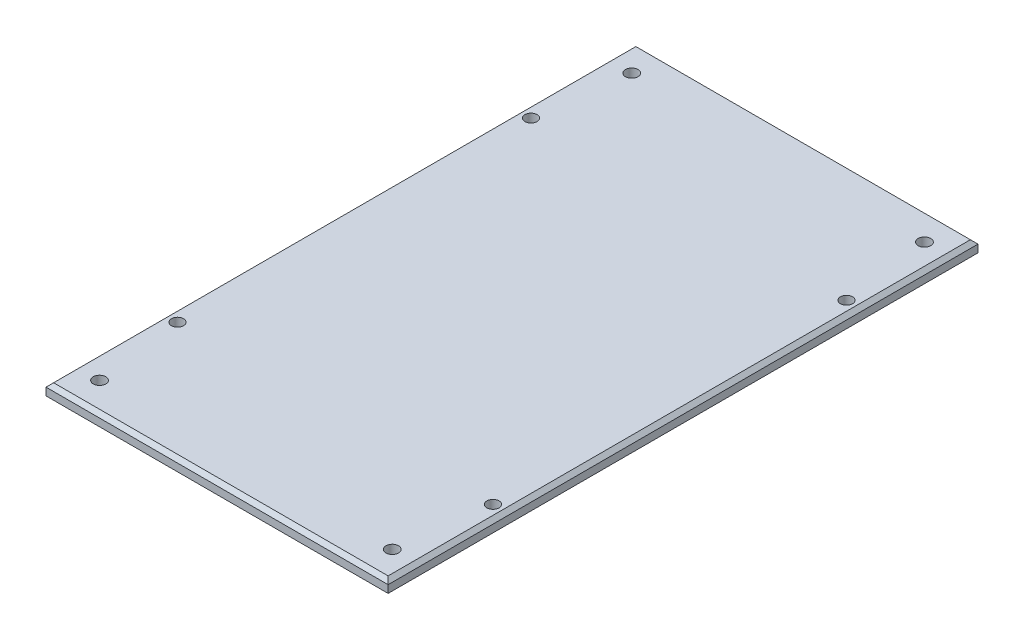
ISO-10303-21;
HEADER;
FILE_DESCRIPTION(('STEP AP214'),'2;1');
FILE_NAME('part.step','',(''),(''),'','','');
FILE_SCHEMA(('AUTOMOTIVE_DESIGN { 1 0 10303 214 1 1 1 1 }'));
ENDSEC;
DATA;
#1=APPLICATION_CONTEXT('core data for automotive mechanical design processes');
#2=APPLICATION_PROTOCOL_DEFINITION('international standard','automotive_design',2000,#1);
#3=PRODUCT_CONTEXT('',#1,'mechanical');
#4=PRODUCT('Part','Part','',(#3));
#5=PRODUCT_RELATED_PRODUCT_CATEGORY('part','',(#4));
#6=PRODUCT_DEFINITION_FORMATION('','',#4);
#7=PRODUCT_DEFINITION_CONTEXT('part definition',#1,'design');
#8=PRODUCT_DEFINITION('design','',#6,#7);
#9=PRODUCT_DEFINITION_SHAPE('','',#8);
#10=(LENGTH_UNIT() NAMED_UNIT(*) SI_UNIT(.MILLI.,.METRE.));
#11=(NAMED_UNIT(*) PLANE_ANGLE_UNIT() SI_UNIT($,.RADIAN.));
#12=(NAMED_UNIT(*) SI_UNIT($,.STERADIAN.) SOLID_ANGLE_UNIT());
#13=UNCERTAINTY_MEASURE_WITH_UNIT(LENGTH_MEASURE(1.E-05),#10,'distance_accuracy_value','');
#14=(GEOMETRIC_REPRESENTATION_CONTEXT(3) GLOBAL_UNCERTAINTY_ASSIGNED_CONTEXT((#13)) GLOBAL_UNIT_ASSIGNED_CONTEXT((#10,
#11,#12)) REPRESENTATION_CONTEXT('',''));
#15=CARTESIAN_POINT('',(0.,0.,0.));
#16=DIRECTION('',(0.,0.,1.));
#17=DIRECTION('',(1.,0.,0.));
#18=AXIS2_PLACEMENT_3D('',#15,#16,#17);
#19=CARTESIAN_POINT('',(0.,3.,0.));
#20=DIRECTION('',(0.,1.,0.));
#21=DIRECTION('',(0.,0.,1.));
#22=AXIS2_PLACEMENT_3D('',#19,#20,#21);
#23=PLANE('',#22);
#24=CARTESIAN_POINT('',(-41.5,3.,46.5));
#25=DIRECTION('',(0.,1.,0.));
#26=DIRECTION('',(0.,0.,1.));
#27=AXIS2_PLACEMENT_3D('',#24,#25,#26);
#28=CIRCLE('',#27,1.60000000000001);
#29=CARTESIAN_POINT('',(-41.5,3.,48.1));
#30=VERTEX_POINT('',#29);
#31=EDGE_CURVE('E274',#30,#30,#28,.T.);
#32=ORIENTED_EDGE('',*,*,#31,.F.);
#33=EDGE_LOOP('',(#32));
#34=FACE_BOUND('',#33,.T.);
#35=CARTESIAN_POINT('',(41.5,3.,46.5));
#36=DIRECTION('',(0.,1.,0.));
#37=DIRECTION('',(0.,0.,1.));
#38=AXIS2_PLACEMENT_3D('',#35,#36,#37);
#39=CIRCLE('',#38,1.60000000000001);
#40=CARTESIAN_POINT('',(41.5,3.,48.1));
#41=VERTEX_POINT('',#40);
#42=EDGE_CURVE('E280',#41,#41,#39,.T.);
#43=ORIENTED_EDGE('',*,*,#42,.F.);
#44=EDGE_LOOP('',(#43));
#45=FACE_BOUND('',#44,.T.);
#46=CARTESIAN_POINT('',(41.5,3.,-46.5));
#47=DIRECTION('',(0.,1.,0.));
#48=DIRECTION('',(0.,0.,1.));
#49=AXIS2_PLACEMENT_3D('',#46,#47,#48);
#50=CIRCLE('',#49,1.60000000000001);
#51=CARTESIAN_POINT('',(41.5,3.,-44.9));
#52=VERTEX_POINT('',#51);
#53=EDGE_CURVE('E286',#52,#52,#50,.T.);
#54=ORIENTED_EDGE('',*,*,#53,.F.);
#55=EDGE_LOOP('',(#54));
#56=FACE_BOUND('',#55,.T.);
#57=CARTESIAN_POINT('',(-41.5,3.,-46.5));
#58=DIRECTION('',(0.,1.,0.));
#59=DIRECTION('',(0.,0.,1.));
#60=AXIS2_PLACEMENT_3D('',#57,#58,#59);
#61=CIRCLE('',#60,1.6);
#62=CARTESIAN_POINT('',(-41.5,3.,-44.9));
#63=VERTEX_POINT('',#62);
#64=EDGE_CURVE('E268',#63,#63,#61,.T.);
#65=ORIENTED_EDGE('',*,*,#64,.F.);
#66=EDGE_LOOP('',(#65));
#67=FACE_BOUND('',#66,.T.);
#68=CARTESIAN_POINT('',(38.5,3.,-70.));
#69=DIRECTION('',(0.,1.,0.));
#70=DIRECTION('',(0.,0.,1.));
#71=AXIS2_PLACEMENT_3D('',#68,#69,#70);
#72=CIRCLE('',#71,1.65517241379311);
#73=CARTESIAN_POINT('',(38.5,3.,-68.3448275862069));
#74=VERTEX_POINT('',#73);
#75=EDGE_CURVE('E252',#74,#74,#72,.T.);
#76=ORIENTED_EDGE('',*,*,#75,.F.);
#77=EDGE_LOOP('',(#76));
#78=FACE_BOUND('',#77,.T.);
#79=CARTESIAN_POINT('',(38.5,3.,70.));
#80=DIRECTION('',(0.,1.,0.));
#81=DIRECTION('',(0.,0.,1.));
#82=AXIS2_PLACEMENT_3D('',#79,#80,#81);
#83=CIRCLE('',#82,1.65517241379311);
#84=CARTESIAN_POINT('',(38.5,3.,71.6551724137931));
#85=VERTEX_POINT('',#84);
#86=EDGE_CURVE('E121',#85,#85,#83,.T.);
#87=ORIENTED_EDGE('',*,*,#86,.F.);
#88=EDGE_LOOP('',(#87));
#89=FACE_BOUND('',#88,.T.);
#90=DIRECTION('',(1.,0.,0.));
#91=VECTOR('',#90,1.);
#92=CARTESIAN_POINT('',(45.,3.,76.5862068965517));
#93=LINE('',#92,#91);
#94=CARTESIAN_POINT('',(-44.,3.,76.5862068965517));
#95=VERTEX_POINT('',#94);
#96=CARTESIAN_POINT('',(44.,3.,76.5862068965517));
#97=VERTEX_POINT('',#96);
#98=EDGE_CURVE('E136',#95,#97,#93,.T.);
#99=ORIENTED_EDGE('',*,*,#98,.T.);
#100=DIRECTION('',(0.,0.,-1.));
#101=VECTOR('',#100,1.);
#102=CARTESIAN_POINT('',(44.,3.,-76.5862068965517));
#103=LINE('',#102,#101);
#104=CARTESIAN_POINT('',(44.,3.,-76.5862068965517));
#105=VERTEX_POINT('',#104);
#106=EDGE_CURVE('E147',#97,#105,#103,.T.);
#107=ORIENTED_EDGE('',*,*,#106,.T.);
#108=DIRECTION('',(-1.,0.,0.));
#109=VECTOR('',#108,1.);
#110=CARTESIAN_POINT('',(-45.,3.,-76.5862068965517));
#111=LINE('',#110,#109);
#112=CARTESIAN_POINT('',(-44.,3.,-76.5862068965517));
#113=VERTEX_POINT('',#112);
#114=EDGE_CURVE('E105',#105,#113,#111,.T.);
#115=ORIENTED_EDGE('',*,*,#114,.T.);
#116=DIRECTION('',(0.,0.,1.));
#117=VECTOR('',#116,1.);
#118=CARTESIAN_POINT('',(-44.,3.,76.5862068965517));
#119=LINE('',#118,#117);
#120=EDGE_CURVE('E144',#113,#95,#119,.T.);
#121=ORIENTED_EDGE('',*,*,#120,.T.);
#122=EDGE_LOOP('',(#99,#107,#115,#121));
#123=FACE_BOUND('',#122,.T.);
#124=CARTESIAN_POINT('',(-38.5,3.,70.));
#125=DIRECTION('',(0.,1.,0.));
#126=DIRECTION('',(0.,0.,1.));
#127=AXIS2_PLACEMENT_3D('',#124,#125,#126);
#128=CIRCLE('',#127,1.65517241379311);
#129=CARTESIAN_POINT('',(-38.5,3.,71.6551724137931));
#130=VERTEX_POINT('',#129);
#131=EDGE_CURVE('E247',#130,#130,#128,.T.);
#132=ORIENTED_EDGE('',*,*,#131,.F.);
#133=EDGE_LOOP('',(#132));
#134=FACE_BOUND('',#133,.T.);
#135=CARTESIAN_POINT('',(-38.5,3.,-70.));
#136=DIRECTION('',(0.,1.,0.));
#137=DIRECTION('',(0.,0.,1.));
#138=AXIS2_PLACEMENT_3D('',#135,#136,#137);
#139=CIRCLE('',#138,1.65517241379311);
#140=CARTESIAN_POINT('',(-38.5,3.,-68.3448275862069));
#141=VERTEX_POINT('',#140);
#142=EDGE_CURVE('E260',#141,#141,#139,.T.);
#143=ORIENTED_EDGE('',*,*,#142,.F.);
#144=EDGE_LOOP('',(#143));
#145=FACE_BOUND('',#144,.T.);
#146=ADVANCED_FACE('F39',(#34,#45,#56,#67,#78,#89,#123,#134,#145),#23,.T.);
#147=CARTESIAN_POINT('',(0.,0.,0.));
#148=DIRECTION('',(0.,1.,0.));
#149=DIRECTION('',(0.,0.,1.));
#150=AXIS2_PLACEMENT_3D('',#147,#148,#149);
#151=PLANE('',#150);
#152=CARTESIAN_POINT('',(-41.5,0.,46.5));
#153=DIRECTION('',(0.,1.,0.));
#154=DIRECTION('',(0.,0.,1.));
#155=AXIS2_PLACEMENT_3D('',#152,#153,#154);
#156=CIRCLE('',#155,1.60000000000001);
#157=CARTESIAN_POINT('',(-41.5,0.,48.1));
#158=VERTEX_POINT('',#157);
#159=EDGE_CURVE('E277',#158,#158,#156,.T.);
#160=ORIENTED_EDGE('',*,*,#159,.T.);
#161=EDGE_LOOP('',(#160));
#162=FACE_BOUND('',#161,.T.);
#163=CARTESIAN_POINT('',(41.5,0.,46.5));
#164=DIRECTION('',(0.,1.,0.));
#165=DIRECTION('',(0.,0.,1.));
#166=AXIS2_PLACEMENT_3D('',#163,#164,#165);
#167=CIRCLE('',#166,1.60000000000001);
#168=CARTESIAN_POINT('',(41.5,0.,48.1));
#169=VERTEX_POINT('',#168);
#170=EDGE_CURVE('E283',#169,#169,#167,.T.);
#171=ORIENTED_EDGE('',*,*,#170,.T.);
#172=EDGE_LOOP('',(#171));
#173=FACE_BOUND('',#172,.T.);
#174=CARTESIAN_POINT('',(41.5,0.,-46.5));
#175=DIRECTION('',(0.,1.,0.));
#176=DIRECTION('',(0.,0.,1.));
#177=AXIS2_PLACEMENT_3D('',#174,#175,#176);
#178=CIRCLE('',#177,1.60000000000001);
#179=CARTESIAN_POINT('',(41.5,0.,-44.9));
#180=VERTEX_POINT('',#179);
#181=EDGE_CURVE('E271',#180,#180,#178,.T.);
#182=ORIENTED_EDGE('',*,*,#181,.T.);
#183=EDGE_LOOP('',(#182));
#184=FACE_BOUND('',#183,.T.);
#185=CARTESIAN_POINT('',(-41.5,0.,-46.5));
#186=DIRECTION('',(0.,1.,0.));
#187=DIRECTION('',(0.,0.,1.));
#188=AXIS2_PLACEMENT_3D('',#185,#186,#187);
#189=CIRCLE('',#188,1.6);
#190=CARTESIAN_POINT('',(-41.5,0.,-44.9));
#191=VERTEX_POINT('',#190);
#192=EDGE_CURVE('E265',#191,#191,#189,.T.);
#193=ORIENTED_EDGE('',*,*,#192,.T.);
#194=EDGE_LOOP('',(#193));
#195=FACE_BOUND('',#194,.T.);
#196=DIRECTION('',(-1.,0.,0.));
#197=VECTOR('',#196,1.);
#198=CARTESIAN_POINT('',(45.,0.,-77.5862068965517));
#199=LINE('',#198,#197);
#200=CARTESIAN_POINT('',(45.,0.,-77.5862068965517));
#201=VERTEX_POINT('',#200);
#202=CARTESIAN_POINT('',(-45.,0.,-77.5862068965517));
#203=VERTEX_POINT('',#202);
#204=EDGE_CURVE('E113',#201,#203,#199,.T.);
#205=ORIENTED_EDGE('',*,*,#204,.F.);
#206=DIRECTION('',(0.,0.,-1.));
#207=VECTOR('',#206,1.);
#208=CARTESIAN_POINT('',(45.,0.,77.5862068965518));
#209=LINE('',#208,#207);
#210=CARTESIAN_POINT('',(45.,0.,77.5862068965518));
#211=VERTEX_POINT('',#210);
#212=EDGE_CURVE('E129',#211,#201,#209,.T.);
#213=ORIENTED_EDGE('',*,*,#212,.F.);
#214=DIRECTION('',(1.,0.,0.));
#215=VECTOR('',#214,1.);
#216=CARTESIAN_POINT('',(-45.,0.,77.5862068965518));
#217=LINE('',#216,#215);
#218=CARTESIAN_POINT('',(-45.,0.,77.5862068965518));
#219=VERTEX_POINT('',#218);
#220=EDGE_CURVE('E115',#219,#211,#217,.T.);
#221=ORIENTED_EDGE('',*,*,#220,.F.);
#222=DIRECTION('',(0.,0.,1.));
#223=VECTOR('',#222,1.);
#224=CARTESIAN_POINT('',(-45.,0.,-77.5862068965517));
#225=LINE('',#224,#223);
#226=EDGE_CURVE('E99',#203,#219,#225,.T.);
#227=ORIENTED_EDGE('',*,*,#226,.F.);
#228=EDGE_LOOP('',(#205,#213,#221,#227));
#229=FACE_BOUND('',#228,.T.);
#230=CARTESIAN_POINT('',(38.5,0.,70.));
#231=DIRECTION('',(0.,1.,0.));
#232=DIRECTION('',(0.,0.,1.));
#233=AXIS2_PLACEMENT_3D('',#230,#231,#232);
#234=CIRCLE('',#233,1.65517241379311);
#235=CARTESIAN_POINT('',(38.5,0.,71.6551724137931));
#236=VERTEX_POINT('',#235);
#237=EDGE_CURVE('E124',#236,#236,#234,.T.);
#238=ORIENTED_EDGE('',*,*,#237,.T.);
#239=EDGE_LOOP('',(#238));
#240=FACE_BOUND('',#239,.T.);
#241=CARTESIAN_POINT('',(-38.5,0.,70.));
#242=DIRECTION('',(0.,1.,0.));
#243=DIRECTION('',(0.,0.,1.));
#244=AXIS2_PLACEMENT_3D('',#241,#242,#243);
#245=CIRCLE('',#244,1.65517241379311);
#246=CARTESIAN_POINT('',(-38.5,0.,71.6551724137931));
#247=VERTEX_POINT('',#246);
#248=EDGE_CURVE('E250',#247,#247,#245,.T.);
#249=ORIENTED_EDGE('',*,*,#248,.T.);
#250=EDGE_LOOP('',(#249));
#251=FACE_BOUND('',#250,.T.);
#252=CARTESIAN_POINT('',(38.5,0.,-70.));
#253=DIRECTION('',(0.,1.,0.));
#254=DIRECTION('',(0.,0.,1.));
#255=AXIS2_PLACEMENT_3D('',#252,#253,#254);
#256=CIRCLE('',#255,1.65517241379311);
#257=CARTESIAN_POINT('',(38.5,0.,-68.3448275862069));
#258=VERTEX_POINT('',#257);
#259=EDGE_CURVE('E256',#258,#258,#256,.T.);
#260=ORIENTED_EDGE('',*,*,#259,.T.);
#261=EDGE_LOOP('',(#260));
#262=FACE_BOUND('',#261,.T.);
#263=CARTESIAN_POINT('',(-38.5,0.,-70.));
#264=DIRECTION('',(0.,1.,0.));
#265=DIRECTION('',(0.,0.,1.));
#266=AXIS2_PLACEMENT_3D('',#263,#264,#265);
#267=CIRCLE('',#266,1.65517241379311);
#268=CARTESIAN_POINT('',(-38.5,0.,-68.3448275862069));
#269=VERTEX_POINT('',#268);
#270=EDGE_CURVE('E262',#269,#269,#267,.T.);
#271=ORIENTED_EDGE('',*,*,#270,.T.);
#272=EDGE_LOOP('',(#271));
#273=FACE_BOUND('',#272,.T.);
#274=ADVANCED_FACE('F110',(#162,#173,#184,#195,#229,#240,#251,#262,#273),#151,.F.);
#275=CARTESIAN_POINT('',(45.,3.,-77.5862068965517));
#276=DIRECTION('',(0.,0.,1.));
#277=DIRECTION('',(1.,0.,0.));
#278=AXIS2_PLACEMENT_3D('',#275,#276,#277);
#279=PLANE('',#278);
#280=DIRECTION('',(0.,-1.,0.));
#281=VECTOR('',#280,1.);
#282=CARTESIAN_POINT('',(-45.,3.,-77.5862068965517));
#283=LINE('',#282,#281);
#284=CARTESIAN_POINT('',(-45.,1.99999999999997,-77.5862068965517));
#285=VERTEX_POINT('',#284);
#286=EDGE_CURVE('E95',#285,#203,#283,.T.);
#287=ORIENTED_EDGE('',*,*,#286,.F.);
#288=DIRECTION('',(1.,0.,0.));
#289=VECTOR('',#288,1.);
#290=CARTESIAN_POINT('',(45.,1.99999999999997,-77.5862068965517));
#291=LINE('',#290,#289);
#292=CARTESIAN_POINT('',(45.,1.99999999999997,-77.5862068965517));
#293=VERTEX_POINT('',#292);
#294=EDGE_CURVE('E142',#285,#293,#291,.T.);
#295=ORIENTED_EDGE('',*,*,#294,.T.);
#296=DIRECTION('',(0.,-1.,0.));
#297=VECTOR('',#296,1.);
#298=CARTESIAN_POINT('',(45.,3.,-77.5862068965517));
#299=LINE('',#298,#297);
#300=EDGE_CURVE('E119',#293,#201,#299,.T.);
#301=ORIENTED_EDGE('',*,*,#300,.T.);
#302=ORIENTED_EDGE('',*,*,#204,.T.);
#303=EDGE_LOOP('',(#287,#295,#301,#302));
#304=FACE_BOUND('',#303,.T.);
#305=ADVANCED_FACE('F117',(#304),#279,.F.);
#306=CARTESIAN_POINT('',(-45.,3.,-77.5862068965517));
#307=DIRECTION('',(1.,0.,0.));
#308=DIRECTION('',(0.,0.,-1.));
#309=AXIS2_PLACEMENT_3D('',#306,#307,#308);
#310=PLANE('',#309);
#311=DIRECTION('',(0.,-1.,0.));
#312=VECTOR('',#311,1.);
#313=CARTESIAN_POINT('',(-45.,3.,77.5862068965518));
#314=LINE('',#313,#312);
#315=CARTESIAN_POINT('',(-45.,1.99999999999997,77.5862068965518));
#316=VERTEX_POINT('',#315);
#317=EDGE_CURVE('E106',#316,#219,#314,.T.);
#318=ORIENTED_EDGE('',*,*,#317,.F.);
#319=DIRECTION('',(0.,0.,-1.));
#320=VECTOR('',#319,1.);
#321=CARTESIAN_POINT('',(-45.,2.00000000000003,-76.5862068965517));
#322=LINE('',#321,#320);
#323=EDGE_CURVE('E11',#316,#285,#322,.T.);
#324=ORIENTED_EDGE('',*,*,#323,.T.);
#325=ORIENTED_EDGE('',*,*,#286,.T.);
#326=ORIENTED_EDGE('',*,*,#226,.T.);
#327=EDGE_LOOP('',(#318,#324,#325,#326));
#328=FACE_BOUND('',#327,.T.);
#329=ADVANCED_FACE('F98',(#328),#310,.F.);
#330=CARTESIAN_POINT('',(-45.,3.,77.5862068965518));
#331=DIRECTION('',(0.,0.,-1.));
#332=DIRECTION('',(-1.,0.,0.));
#333=AXIS2_PLACEMENT_3D('',#330,#331,#332);
#334=PLANE('',#333);
#335=DIRECTION('',(0.,-1.,0.));
#336=VECTOR('',#335,1.);
#337=CARTESIAN_POINT('',(45.,3.,77.5862068965518));
#338=LINE('',#337,#336);
#339=CARTESIAN_POINT('',(45.,1.99999999999997,77.5862068965518));
#340=VERTEX_POINT('',#339);
#341=EDGE_CURVE('E132',#340,#211,#338,.T.);
#342=ORIENTED_EDGE('',*,*,#341,.F.);
#343=DIRECTION('',(-1.,0.,0.));
#344=VECTOR('',#343,1.);
#345=CARTESIAN_POINT('',(-45.,1.99999999999997,77.5862068965518));
#346=LINE('',#345,#344);
#347=EDGE_CURVE('E139',#340,#316,#346,.T.);
#348=ORIENTED_EDGE('',*,*,#347,.T.);
#349=ORIENTED_EDGE('',*,*,#317,.T.);
#350=ORIENTED_EDGE('',*,*,#220,.T.);
#351=EDGE_LOOP('',(#342,#348,#349,#350));
#352=FACE_BOUND('',#351,.T.);
#353=ADVANCED_FACE('F189',(#352),#334,.F.);
#354=CARTESIAN_POINT('',(45.,3.,77.5862068965518));
#355=DIRECTION('',(-1.,0.,0.));
#356=DIRECTION('',(0.,0.,1.));
#357=AXIS2_PLACEMENT_3D('',#354,#355,#356);
#358=PLANE('',#357);
#359=ORIENTED_EDGE('',*,*,#300,.F.);
#360=DIRECTION('',(0.,0.,1.));
#361=VECTOR('',#360,1.);
#362=CARTESIAN_POINT('',(45.,2.00000000000003,76.5862068965517));
#363=LINE('',#362,#361);
#364=EDGE_CURVE('E151',#293,#340,#363,.T.);
#365=ORIENTED_EDGE('',*,*,#364,.T.);
#366=ORIENTED_EDGE('',*,*,#341,.T.);
#367=ORIENTED_EDGE('',*,*,#212,.T.);
#368=EDGE_LOOP('',(#359,#365,#366,#367));
#369=FACE_BOUND('',#368,.T.);
#370=ADVANCED_FACE('F186',(#369),#358,.F.);
#371=CARTESIAN_POINT('',(38.5,3.,70.));
#372=DIRECTION('',(0.,-1.,0.));
#373=DIRECTION('',(0.,0.,-1.));
#374=AXIS2_PLACEMENT_3D('',#371,#372,#373);
#375=CYLINDRICAL_SURFACE('',#374,1.65517241379311);
#376=ORIENTED_EDGE('',*,*,#86,.T.);
#377=EDGE_LOOP('',(#376));
#378=FACE_BOUND('',#377,.T.);
#379=ORIENTED_EDGE('',*,*,#237,.F.);
#380=EDGE_LOOP('',(#379));
#381=FACE_BOUND('',#380,.T.);
#382=ADVANCED_FACE('F183',(#378,#381),#375,.F.);
#383=CARTESIAN_POINT('',(-38.5,3.,70.));
#384=DIRECTION('',(0.,-1.,0.));
#385=DIRECTION('',(0.,0.,-1.));
#386=AXIS2_PLACEMENT_3D('',#383,#384,#385);
#387=CYLINDRICAL_SURFACE('',#386,1.65517241379311);
#388=ORIENTED_EDGE('',*,*,#131,.T.);
#389=EDGE_LOOP('',(#388));
#390=FACE_BOUND('',#389,.T.);
#391=ORIENTED_EDGE('',*,*,#248,.F.);
#392=EDGE_LOOP('',(#391));
#393=FACE_BOUND('',#392,.T.);
#394=ADVANCED_FACE('F236',(#390,#393),#387,.F.);
#395=CARTESIAN_POINT('',(38.5,3.,-70.));
#396=DIRECTION('',(0.,-1.,0.));
#397=DIRECTION('',(0.,0.,-1.));
#398=AXIS2_PLACEMENT_3D('',#395,#396,#397);
#399=CYLINDRICAL_SURFACE('',#398,1.65517241379311);
#400=ORIENTED_EDGE('',*,*,#75,.T.);
#401=EDGE_LOOP('',(#400));
#402=FACE_BOUND('',#401,.T.);
#403=ORIENTED_EDGE('',*,*,#259,.F.);
#404=EDGE_LOOP('',(#403));
#405=FACE_BOUND('',#404,.T.);
#406=ADVANCED_FACE('F233',(#402,#405),#399,.F.);
#407=CARTESIAN_POINT('',(-38.5,3.,-70.));
#408=DIRECTION('',(0.,-1.,0.));
#409=DIRECTION('',(0.,0.,-1.));
#410=AXIS2_PLACEMENT_3D('',#407,#408,#409);
#411=CYLINDRICAL_SURFACE('',#410,1.65517241379311);
#412=ORIENTED_EDGE('',*,*,#142,.T.);
#413=EDGE_LOOP('',(#412));
#414=FACE_BOUND('',#413,.T.);
#415=ORIENTED_EDGE('',*,*,#270,.F.);
#416=EDGE_LOOP('',(#415));
#417=FACE_BOUND('',#416,.T.);
#418=ADVANCED_FACE('F229',(#414,#417),#411,.F.);
#419=CARTESIAN_POINT('',(-41.5,0.,-46.5));
#420=DIRECTION('',(0.,1.,0.));
#421=DIRECTION('',(0.,0.,1.));
#422=AXIS2_PLACEMENT_3D('',#419,#420,#421);
#423=CYLINDRICAL_SURFACE('',#422,1.6);
#424=ORIENTED_EDGE('',*,*,#192,.F.);
#425=EDGE_LOOP('',(#424));
#426=FACE_BOUND('',#425,.T.);
#427=ORIENTED_EDGE('',*,*,#64,.T.);
#428=EDGE_LOOP('',(#427));
#429=FACE_BOUND('',#428,.T.);
#430=ADVANCED_FACE('F226',(#426,#429),#423,.F.);
#431=CARTESIAN_POINT('',(41.5,0.,-46.5));
#432=DIRECTION('',(0.,1.,0.));
#433=DIRECTION('',(0.,0.,1.));
#434=AXIS2_PLACEMENT_3D('',#431,#432,#433);
#435=CYLINDRICAL_SURFACE('',#434,1.60000000000001);
#436=ORIENTED_EDGE('',*,*,#181,.F.);
#437=EDGE_LOOP('',(#436));
#438=FACE_BOUND('',#437,.T.);
#439=ORIENTED_EDGE('',*,*,#53,.T.);
#440=EDGE_LOOP('',(#439));
#441=FACE_BOUND('',#440,.T.);
#442=ADVANCED_FACE('F219',(#438,#441),#435,.F.);
#443=CARTESIAN_POINT('',(41.5,0.,46.5));
#444=DIRECTION('',(0.,1.,0.));
#445=DIRECTION('',(0.,0.,1.));
#446=AXIS2_PLACEMENT_3D('',#443,#444,#445);
#447=CYLINDRICAL_SURFACE('',#446,1.60000000000001);
#448=ORIENTED_EDGE('',*,*,#170,.F.);
#449=EDGE_LOOP('',(#448));
#450=FACE_BOUND('',#449,.T.);
#451=ORIENTED_EDGE('',*,*,#42,.T.);
#452=EDGE_LOOP('',(#451));
#453=FACE_BOUND('',#452,.T.);
#454=ADVANCED_FACE('F213',(#450,#453),#447,.F.);
#455=CARTESIAN_POINT('',(-41.5,0.,46.5));
#456=DIRECTION('',(0.,1.,0.));
#457=DIRECTION('',(0.,0.,1.));
#458=AXIS2_PLACEMENT_3D('',#455,#456,#457);
#459=CYLINDRICAL_SURFACE('',#458,1.60000000000001);
#460=ORIENTED_EDGE('',*,*,#159,.F.);
#461=EDGE_LOOP('',(#460));
#462=FACE_BOUND('',#461,.T.);
#463=ORIENTED_EDGE('',*,*,#31,.T.);
#464=EDGE_LOOP('',(#463));
#465=FACE_BOUND('',#464,.T.);
#466=ADVANCED_FACE('F203',(#462,#465),#459,.F.);
#467=CARTESIAN_POINT('',(0.,3.,76.5862068965517));
#468=DIRECTION('',(0.,0.707106781186548,0.707106781186548));
#469=DIRECTION('',(-1.,0.,0.));
#470=AXIS2_PLACEMENT_3D('',#467,#468,#469);
#471=PLANE('',#470);
#472=ORIENTED_EDGE('',*,*,#347,.F.);
#473=DIRECTION('',(-0.577350269189622,0.577350269189628,-0.577350269189628));
#474=VECTOR('',#473,1.);
#475=CARTESIAN_POINT('',(29.3333333333336,17.6666666666666,61.9195402298851));
#476=LINE('',#475,#474);
#477=EDGE_CURVE('E48',#340,#97,#476,.T.);
#478=ORIENTED_EDGE('',*,*,#477,.T.);
#479=ORIENTED_EDGE('',*,*,#98,.F.);
#480=DIRECTION('',(-0.577350269189626,-0.577350269189626,0.577350269189626));
#481=VECTOR('',#480,1.);
#482=CARTESIAN_POINT('',(-29.3333333333333,17.6666666666667,61.9195402298851));
#483=LINE('',#482,#481);
#484=EDGE_CURVE('E153',#95,#316,#483,.T.);
#485=ORIENTED_EDGE('',*,*,#484,.T.);
#486=EDGE_LOOP('',(#472,#478,#479,#485));
#487=FACE_BOUND('',#486,.T.);
#488=ADVANCED_FACE('F158',(#487),#471,.T.);
#489=CARTESIAN_POINT('',(0.,3.,-76.5862068965517));
#490=DIRECTION('',(0.,0.707106781186548,-0.707106781186548));
#491=DIRECTION('',(1.,0.,0.));
#492=AXIS2_PLACEMENT_3D('',#489,#490,#491);
#493=PLANE('',#492);
#494=ORIENTED_EDGE('',*,*,#114,.F.);
#495=DIRECTION('',(0.577350269189622,-0.577350269189628,-0.577350269189628));
#496=VECTOR('',#495,1.);
#497=CARTESIAN_POINT('',(29.3333333333336,17.6666666666666,-61.919540229885));
#498=LINE('',#497,#496);
#499=EDGE_CURVE('E63',#105,#293,#498,.T.);
#500=ORIENTED_EDGE('',*,*,#499,.T.);
#501=ORIENTED_EDGE('',*,*,#294,.F.);
#502=DIRECTION('',(0.577350269189626,0.577350269189626,0.577350269189626));
#503=VECTOR('',#502,1.);
#504=CARTESIAN_POINT('',(-29.3333333333333,17.6666666666667,-61.919540229885));
#505=LINE('',#504,#503);
#506=EDGE_CURVE('E55',#285,#113,#505,.T.);
#507=ORIENTED_EDGE('',*,*,#506,.T.);
#508=EDGE_LOOP('',(#494,#500,#501,#507));
#509=FACE_BOUND('',#508,.T.);
#510=ADVANCED_FACE('F164',(#509),#493,.T.);
#511=CARTESIAN_POINT('',(44.,3.,0.));
#512=DIRECTION('',(0.707106781186551,0.707106781186544,0.));
#513=DIRECTION('',(0.,0.,1.));
#514=AXIS2_PLACEMENT_3D('',#511,#512,#513);
#515=PLANE('',#514);
#516=ORIENTED_EDGE('',*,*,#477,.F.);
#517=ORIENTED_EDGE('',*,*,#364,.F.);
#518=ORIENTED_EDGE('',*,*,#499,.F.);
#519=ORIENTED_EDGE('',*,*,#106,.F.);
#520=EDGE_LOOP('',(#516,#517,#518,#519));
#521=FACE_BOUND('',#520,.T.);
#522=ADVANCED_FACE('F162',(#521),#515,.T.);
#523=CARTESIAN_POINT('',(-44.,3.,0.));
#524=DIRECTION('',(-0.707106781186548,0.707106781186548,0.));
#525=DIRECTION('',(0.,0.,-1.));
#526=AXIS2_PLACEMENT_3D('',#523,#524,#525);
#527=PLANE('',#526);
#528=ORIENTED_EDGE('',*,*,#506,.F.);
#529=ORIENTED_EDGE('',*,*,#323,.F.);
#530=ORIENTED_EDGE('',*,*,#484,.F.);
#531=ORIENTED_EDGE('',*,*,#120,.F.);
#532=EDGE_LOOP('',(#528,#529,#530,#531));
#533=FACE_BOUND('',#532,.T.);
#534=ADVANCED_FACE('F42',(#533),#527,.T.);
#535=CLOSED_SHELL('',(#146,#274,#305,#329,#353,#370,#382,#394,#406,#418,#430,#442,#454,#466,
#488,#510,#522,#534));
#536=MANIFOLD_SOLID_BREP('B2',#535);
#537=ADVANCED_BREP_SHAPE_REPRESENTATION('',(#18,#536),#14);
#538=SHAPE_DEFINITION_REPRESENTATION(#9,#537);
ENDSEC;
END-ISO-10303-21;
